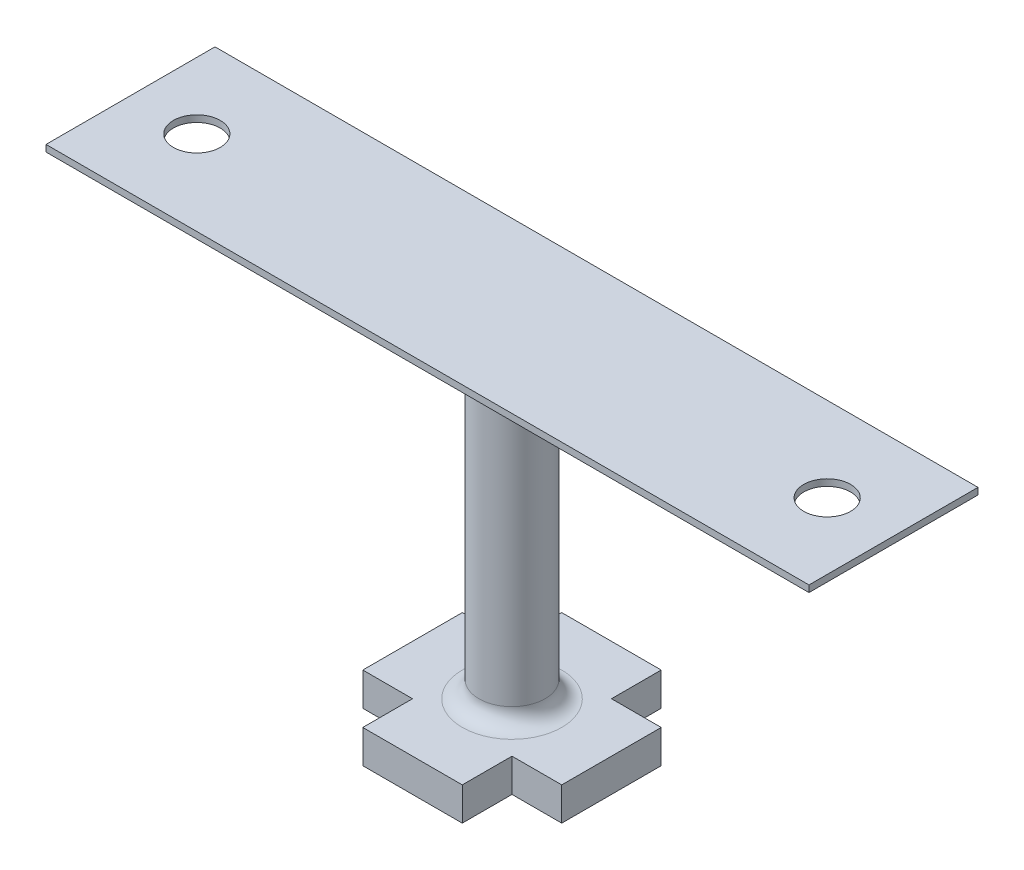
ISO-10303-21;
HEADER;
FILE_DESCRIPTION(('STEP AP214'),'2;1');
FILE_NAME('part.step','',(''),(''),'','','');
FILE_SCHEMA(('AUTOMOTIVE_DESIGN { 1 0 10303 214 1 1 1 1 }'));
ENDSEC;
DATA;
#1=APPLICATION_CONTEXT('core data for automotive mechanical design processes');
#2=APPLICATION_PROTOCOL_DEFINITION('international standard','automotive_design',2000,#1);
#3=PRODUCT_CONTEXT('',#1,'mechanical');
#4=PRODUCT('Part','Part','',(#3));
#5=PRODUCT_RELATED_PRODUCT_CATEGORY('part','',(#4));
#6=PRODUCT_DEFINITION_FORMATION('','',#4);
#7=PRODUCT_DEFINITION_CONTEXT('part definition',#1,'design');
#8=PRODUCT_DEFINITION('design','',#6,#7);
#9=PRODUCT_DEFINITION_SHAPE('','',#8);
#10=(LENGTH_UNIT() NAMED_UNIT(*) SI_UNIT(.MILLI.,.METRE.));
#11=(NAMED_UNIT(*) PLANE_ANGLE_UNIT() SI_UNIT($,.RADIAN.));
#12=(NAMED_UNIT(*) SI_UNIT($,.STERADIAN.) SOLID_ANGLE_UNIT());
#13=UNCERTAINTY_MEASURE_WITH_UNIT(LENGTH_MEASURE(1.E-05),#10,'distance_accuracy_value','');
#14=(GEOMETRIC_REPRESENTATION_CONTEXT(3) GLOBAL_UNCERTAINTY_ASSIGNED_CONTEXT((#13)) GLOBAL_UNIT_ASSIGNED_CONTEXT((#10,
#11,#12)) REPRESENTATION_CONTEXT('',''));
#15=CARTESIAN_POINT('',(0.,0.,0.));
#16=DIRECTION('',(0.,0.,1.));
#17=DIRECTION('',(1.,0.,0.));
#18=AXIS2_PLACEMENT_3D('',#15,#16,#17);
#19=CARTESIAN_POINT('',(0.,2.,0.));
#20=DIRECTION('',(0.,-1.,0.));
#21=DIRECTION('',(0.,0.,-1.));
#22=AXIS2_PLACEMENT_3D('',#19,#20,#21);
#23=PLANE('',#22);
#24=DIRECTION('',(0.,0.,-1.));
#25=VECTOR('',#24,1.);
#26=CARTESIAN_POINT('',(115.06,2.,25.4874549375349));
#27=LINE('',#26,#25);
#28=CARTESIAN_POINT('',(115.06,2.,25.4874549375349));
#29=VERTEX_POINT('',#28);
#30=CARTESIAN_POINT('',(115.06,2.,-25.4874549375349));
#31=VERTEX_POINT('',#30);
#32=EDGE_CURVE('E200',#29,#31,#27,.T.);
#33=ORIENTED_EDGE('',*,*,#32,.T.);
#34=DIRECTION('',(-1.,0.,0.));
#35=VECTOR('',#34,1.);
#36=CARTESIAN_POINT('',(-115.06,2.,-25.4874549375349));
#37=LINE('',#36,#35);
#38=CARTESIAN_POINT('',(-115.06,2.,-25.4874549375349));
#39=VERTEX_POINT('',#38);
#40=EDGE_CURVE('E82',#31,#39,#37,.T.);
#41=ORIENTED_EDGE('',*,*,#40,.T.);
#42=DIRECTION('',(0.,0.,1.));
#43=VECTOR('',#42,1.);
#44=CARTESIAN_POINT('',(-115.06,2.,25.4874549375349));
#45=LINE('',#44,#43);
#46=CARTESIAN_POINT('',(-115.06,2.,25.4874549375349));
#47=VERTEX_POINT('',#46);
#48=EDGE_CURVE('E203',#39,#47,#45,.T.);
#49=ORIENTED_EDGE('',*,*,#48,.T.);
#50=DIRECTION('',(1.,0.,0.));
#51=VECTOR('',#50,1.);
#52=CARTESIAN_POINT('',(-115.06,2.,25.4874549375349));
#53=LINE('',#52,#51);
#54=EDGE_CURVE('E50',#47,#29,#53,.T.);
#55=ORIENTED_EDGE('',*,*,#54,.T.);
#56=EDGE_LOOP('',(#33,#41,#49,#55));
#57=FACE_BOUND('',#56,.T.);
#58=CARTESIAN_POINT('',(-95.06,2.,0.));
#59=DIRECTION('',(0.,1.,0.));
#60=DIRECTION('',(0.,0.,1.));
#61=AXIS2_PLACEMENT_3D('',#58,#59,#60);
#62=CIRCLE('',#61,7.05817378497791);
#63=CARTESIAN_POINT('',(-95.06,2.,7.0581737849779));
#64=VERTEX_POINT('',#63);
#65=EDGE_CURVE('E194',#64,#64,#62,.T.);
#66=ORIENTED_EDGE('',*,*,#65,.F.);
#67=EDGE_LOOP('',(#66));
#68=FACE_BOUND('',#67,.T.);
#69=CARTESIAN_POINT('',(95.06,2.,0.));
#70=DIRECTION('',(0.,1.,0.));
#71=DIRECTION('',(0.,0.,1.));
#72=AXIS2_PLACEMENT_3D('',#69,#70,#71);
#73=CIRCLE('',#72,7.05817378497791);
#74=CARTESIAN_POINT('',(95.06,2.,7.05817378497784));
#75=VERTEX_POINT('',#74);
#76=EDGE_CURVE('E185',#75,#75,#73,.T.);
#77=ORIENTED_EDGE('',*,*,#76,.F.);
#78=EDGE_LOOP('',(#77));
#79=FACE_BOUND('',#78,.T.);
#80=ADVANCED_FACE('F33',(#57,#68,#79),#23,.F.);
#81=CARTESIAN_POINT('',(0.,0.,0.));
#82=DIRECTION('',(0.,-1.,0.));
#83=DIRECTION('',(0.,0.,-1.));
#84=AXIS2_PLACEMENT_3D('',#81,#82,#83);
#85=PLANE('',#84);
#86=CARTESIAN_POINT('',(0.,0.,0.));
#87=DIRECTION('',(0.,-1.,0.));
#88=DIRECTION('',(0.,0.,-1.));
#89=AXIS2_PLACEMENT_3D('',#86,#87,#88);
#90=CIRCLE('',#89,15.);
#91=CARTESIAN_POINT('',(0.,0.,-15.));
#92=VERTEX_POINT('',#91);
#93=EDGE_CURVE('E42',#92,#92,#90,.F.);
#94=ORIENTED_EDGE('',*,*,#93,.T.);
#95=EDGE_LOOP('',(#94));
#96=FACE_BOUND('',#95,.T.);
#97=CARTESIAN_POINT('',(-95.06,0.,0.));
#98=DIRECTION('',(0.,1.,0.));
#99=DIRECTION('',(0.,0.,1.));
#100=AXIS2_PLACEMENT_3D('',#97,#98,#99);
#101=CIRCLE('',#100,7.05817378497791);
#102=CARTESIAN_POINT('',(-95.06,0.,7.0581737849779));
#103=VERTEX_POINT('',#102);
#104=EDGE_CURVE('E192',#103,#103,#101,.T.);
#105=ORIENTED_EDGE('',*,*,#104,.T.);
#106=EDGE_LOOP('',(#105));
#107=FACE_BOUND('',#106,.T.);
#108=DIRECTION('',(0.,0.,-1.));
#109=VECTOR('',#108,1.);
#110=CARTESIAN_POINT('',(115.06,0.,25.4874549375349));
#111=LINE('',#110,#109);
#112=CARTESIAN_POINT('',(115.06,0.,25.4874549375349));
#113=VERTEX_POINT('',#112);
#114=CARTESIAN_POINT('',(115.06,0.,-25.4874549375349));
#115=VERTEX_POINT('',#114);
#116=EDGE_CURVE('E197',#113,#115,#111,.T.);
#117=ORIENTED_EDGE('',*,*,#116,.F.);
#118=DIRECTION('',(1.,0.,0.));
#119=VECTOR('',#118,1.);
#120=CARTESIAN_POINT('',(-115.06,0.,25.4874549375349));
#121=LINE('',#120,#119);
#122=CARTESIAN_POINT('',(-115.06,0.,25.4874549375349));
#123=VERTEX_POINT('',#122);
#124=EDGE_CURVE('E74',#123,#113,#121,.T.);
#125=ORIENTED_EDGE('',*,*,#124,.F.);
#126=DIRECTION('',(0.,0.,1.));
#127=VECTOR('',#126,1.);
#128=CARTESIAN_POINT('',(-115.06,0.,25.4874549375349));
#129=LINE('',#128,#127);
#130=CARTESIAN_POINT('',(-115.06,0.,-25.4874549375349));
#131=VERTEX_POINT('',#130);
#132=EDGE_CURVE('E68',#131,#123,#129,.T.);
#133=ORIENTED_EDGE('',*,*,#132,.F.);
#134=DIRECTION('',(-1.,0.,0.));
#135=VECTOR('',#134,1.);
#136=CARTESIAN_POINT('',(-115.06,0.,-25.4874549375349));
#137=LINE('',#136,#135);
#138=EDGE_CURVE('E209',#115,#131,#137,.T.);
#139=ORIENTED_EDGE('',*,*,#138,.F.);
#140=EDGE_LOOP('',(#117,#125,#133,#139));
#141=FACE_BOUND('',#140,.T.);
#142=CARTESIAN_POINT('',(95.06,0.,0.));
#143=DIRECTION('',(0.,1.,0.));
#144=DIRECTION('',(0.,0.,1.));
#145=AXIS2_PLACEMENT_3D('',#142,#143,#144);
#146=CIRCLE('',#145,7.05817378497791);
#147=CARTESIAN_POINT('',(95.06,0.,7.05817378497784));
#148=VERTEX_POINT('',#147);
#149=EDGE_CURVE('E182',#148,#148,#146,.T.);
#150=ORIENTED_EDGE('',*,*,#149,.T.);
#151=EDGE_LOOP('',(#150));
#152=FACE_BOUND('',#151,.T.);
#153=ADVANCED_FACE('F228',(#96,#107,#141,#152),#85,.T.);
#154=CARTESIAN_POINT('',(115.06,2.,25.4874549375349));
#155=DIRECTION('',(-1.,0.,0.));
#156=DIRECTION('',(0.,0.,1.));
#157=AXIS2_PLACEMENT_3D('',#154,#155,#156);
#158=PLANE('',#157);
#159=ORIENTED_EDGE('',*,*,#116,.T.);
#160=DIRECTION('',(0.,-1.,0.));
#161=VECTOR('',#160,1.);
#162=CARTESIAN_POINT('',(115.06,2.,-25.4874549375349));
#163=LINE('',#162,#161);
#164=EDGE_CURVE('E218',#31,#115,#163,.T.);
#165=ORIENTED_EDGE('',*,*,#164,.F.);
#166=ORIENTED_EDGE('',*,*,#32,.F.);
#167=DIRECTION('',(0.,-1.,0.));
#168=VECTOR('',#167,1.);
#169=CARTESIAN_POINT('',(115.06,2.,25.4874549375349));
#170=LINE('',#169,#168);
#171=EDGE_CURVE('E206',#29,#113,#170,.T.);
#172=ORIENTED_EDGE('',*,*,#171,.T.);
#173=EDGE_LOOP('',(#159,#165,#166,#172));
#174=FACE_BOUND('',#173,.T.);
#175=ADVANCED_FACE('F256',(#174),#158,.F.);
#176=CARTESIAN_POINT('',(-115.06,2.,-25.4874549375349));
#177=DIRECTION('',(0.,0.,1.));
#178=DIRECTION('',(1.,0.,0.));
#179=AXIS2_PLACEMENT_3D('',#176,#177,#178);
#180=PLANE('',#179);
#181=ORIENTED_EDGE('',*,*,#138,.T.);
#182=DIRECTION('',(0.,-1.,0.));
#183=VECTOR('',#182,1.);
#184=CARTESIAN_POINT('',(-115.06,2.,-25.4874549375349));
#185=LINE('',#184,#183);
#186=EDGE_CURVE('E216',#39,#131,#185,.T.);
#187=ORIENTED_EDGE('',*,*,#186,.F.);
#188=ORIENTED_EDGE('',*,*,#40,.F.);
#189=ORIENTED_EDGE('',*,*,#164,.T.);
#190=EDGE_LOOP('',(#181,#187,#188,#189));
#191=FACE_BOUND('',#190,.T.);
#192=ADVANCED_FACE('F269',(#191),#180,.F.);
#193=CARTESIAN_POINT('',(-115.06,2.,25.4874549375349));
#194=DIRECTION('',(1.,0.,0.));
#195=DIRECTION('',(0.,0.,-1.));
#196=AXIS2_PLACEMENT_3D('',#193,#194,#195);
#197=PLANE('',#196);
#198=ORIENTED_EDGE('',*,*,#132,.T.);
#199=DIRECTION('',(0.,-1.,0.));
#200=VECTOR('',#199,1.);
#201=CARTESIAN_POINT('',(-115.06,2.,25.4874549375349));
#202=LINE('',#201,#200);
#203=EDGE_CURVE('E214',#47,#123,#202,.T.);
#204=ORIENTED_EDGE('',*,*,#203,.F.);
#205=ORIENTED_EDGE('',*,*,#48,.F.);
#206=ORIENTED_EDGE('',*,*,#186,.T.);
#207=EDGE_LOOP('',(#198,#204,#205,#206));
#208=FACE_BOUND('',#207,.T.);
#209=ADVANCED_FACE('F266',(#208),#197,.F.);
#210=CARTESIAN_POINT('',(-115.06,2.,25.4874549375349));
#211=DIRECTION('',(0.,0.,-1.));
#212=DIRECTION('',(-1.,0.,0.));
#213=AXIS2_PLACEMENT_3D('',#210,#211,#212);
#214=PLANE('',#213);
#215=ORIENTED_EDGE('',*,*,#124,.T.);
#216=ORIENTED_EDGE('',*,*,#171,.F.);
#217=ORIENTED_EDGE('',*,*,#54,.F.);
#218=ORIENTED_EDGE('',*,*,#203,.T.);
#219=EDGE_LOOP('',(#215,#216,#217,#218));
#220=FACE_BOUND('',#219,.T.);
#221=ADVANCED_FACE('F263',(#220),#214,.F.);
#222=CARTESIAN_POINT('',(-95.06,2.,0.));
#223=DIRECTION('',(0.,-1.,0.));
#224=DIRECTION('',(0.,0.,-1.));
#225=AXIS2_PLACEMENT_3D('',#222,#223,#224);
#226=CYLINDRICAL_SURFACE('',#225,7.05817378497791);
#227=ORIENTED_EDGE('',*,*,#65,.T.);
#228=EDGE_LOOP('',(#227));
#229=FACE_BOUND('',#228,.T.);
#230=ORIENTED_EDGE('',*,*,#104,.F.);
#231=EDGE_LOOP('',(#230));
#232=FACE_BOUND('',#231,.T.);
#233=ADVANCED_FACE('F260',(#229,#232),#226,.F.);
#234=CARTESIAN_POINT('',(95.06,2.,0.));
#235=DIRECTION('',(0.,-1.,0.));
#236=DIRECTION('',(0.,0.,-1.));
#237=AXIS2_PLACEMENT_3D('',#234,#235,#236);
#238=CYLINDRICAL_SURFACE('',#237,7.05817378497791);
#239=ORIENTED_EDGE('',*,*,#76,.T.);
#240=EDGE_LOOP('',(#239));
#241=FACE_BOUND('',#240,.T.);
#242=ORIENTED_EDGE('',*,*,#149,.F.);
#243=EDGE_LOOP('',(#242));
#244=FACE_BOUND('',#243,.T.);
#245=ADVANCED_FACE('F240',(#241,#244),#238,.F.);
#246=CARTESIAN_POINT('',(0.,-98.,0.));
#247=DIRECTION('',(0.,1.,0.));
#248=DIRECTION('',(0.,0.,1.));
#249=AXIS2_PLACEMENT_3D('',#246,#247,#248);
#250=CYLINDRICAL_SURFACE('',#249,10.);
#251=CARTESIAN_POINT('',(0.,-5.00000000000002,0.));
#252=DIRECTION('',(0.,-1.,0.));
#253=DIRECTION('',(0.,0.,-1.));
#254=AXIS2_PLACEMENT_3D('',#251,#252,#253);
#255=CIRCLE('',#254,10.);
#256=CARTESIAN_POINT('',(0.,-5.,10.));
#257=VERTEX_POINT('',#256);
#258=EDGE_CURVE('E223',#257,#257,#255,.T.);
#259=CARTESIAN_POINT('',(0.,-93.,0.));
#260=DIRECTION('',(0.,1.,0.));
#261=DIRECTION('',(0.,0.,1.));
#262=AXIS2_PLACEMENT_3D('',#259,#260,#261);
#263=CIRCLE('',#262,10.);
#264=CARTESIAN_POINT('',(0.,-93.,10.));
#265=VERTEX_POINT('',#264);
#266=EDGE_CURVE('E220',#265,#265,#263,.T.);
#267=CARTESIAN_POINT('',(0.,-5.,10.));
#268=CARTESIAN_POINT('',(0.,-5.91666666666667,10.));
#269=CARTESIAN_POINT('',(0.,-6.83333333333334,10.));
#270=CARTESIAN_POINT('',(0.,-8.66666666666667,10.));
#271=CARTESIAN_POINT('',(0.,-9.58333333333334,10.));
#272=CARTESIAN_POINT('',(0.,-11.4166666666667,10.));
#273=CARTESIAN_POINT('',(0.,-12.3333333333333,10.));
#274=CARTESIAN_POINT('',(0.,-14.1666666666667,10.));
#275=CARTESIAN_POINT('',(0.,-15.0833333333333,10.));
#276=CARTESIAN_POINT('',(0.,-16.9166666666667,10.));
#277=CARTESIAN_POINT('',(0.,-17.8333333333333,10.));
#278=CARTESIAN_POINT('',(0.,-19.6666666666667,10.));
#279=CARTESIAN_POINT('',(0.,-20.5833333333333,10.));
#280=CARTESIAN_POINT('',(0.,-22.4166666666667,10.));
#281=CARTESIAN_POINT('',(0.,-23.3333333333333,10.));
#282=CARTESIAN_POINT('',(0.,-25.1666666666667,10.));
#283=CARTESIAN_POINT('',(0.,-26.0833333333333,10.));
#284=CARTESIAN_POINT('',(0.,-27.9166666666667,10.));
#285=CARTESIAN_POINT('',(0.,-28.8333333333333,10.));
#286=CARTESIAN_POINT('',(0.,-30.6666666666667,10.));
#287=CARTESIAN_POINT('',(0.,-31.5833333333333,10.));
#288=CARTESIAN_POINT('',(0.,-33.4166666666667,10.));
#289=CARTESIAN_POINT('',(0.,-34.3333333333333,10.));
#290=CARTESIAN_POINT('',(0.,-36.1666666666667,10.));
#291=CARTESIAN_POINT('',(0.,-37.0833333333333,10.));
#292=CARTESIAN_POINT('',(0.,-38.9166666666667,10.));
#293=CARTESIAN_POINT('',(0.,-39.8333333333333,10.));
#294=CARTESIAN_POINT('',(0.,-41.6666666666667,10.));
#295=CARTESIAN_POINT('',(0.,-42.5833333333333,10.));
#296=CARTESIAN_POINT('',(0.,-44.4166666666667,10.));
#297=CARTESIAN_POINT('',(0.,-45.3333333333333,10.));
#298=CARTESIAN_POINT('',(0.,-47.1666666666667,10.));
#299=CARTESIAN_POINT('',(0.,-48.0833333333333,10.));
#300=CARTESIAN_POINT('',(0.,-49.9166666666667,10.));
#301=CARTESIAN_POINT('',(0.,-50.8333333333333,10.));
#302=CARTESIAN_POINT('',(0.,-52.6666666666667,10.));
#303=CARTESIAN_POINT('',(0.,-53.5833333333333,10.));
#304=CARTESIAN_POINT('',(0.,-55.4166666666667,10.));
#305=CARTESIAN_POINT('',(0.,-56.3333333333333,10.));
#306=CARTESIAN_POINT('',(0.,-58.1666666666667,10.));
#307=CARTESIAN_POINT('',(0.,-59.0833333333333,10.));
#308=CARTESIAN_POINT('',(0.,-60.9166666666667,10.));
#309=CARTESIAN_POINT('',(0.,-61.8333333333333,10.));
#310=CARTESIAN_POINT('',(0.,-63.6666666666667,10.));
#311=CARTESIAN_POINT('',(0.,-64.5833333333333,10.));
#312=CARTESIAN_POINT('',(0.,-66.4166666666667,10.));
#313=CARTESIAN_POINT('',(0.,-67.3333333333333,10.));
#314=CARTESIAN_POINT('',(0.,-69.1666666666667,10.));
#315=CARTESIAN_POINT('',(0.,-70.0833333333333,10.));
#316=CARTESIAN_POINT('',(0.,-71.9166666666667,10.));
#317=CARTESIAN_POINT('',(0.,-72.8333333333333,10.));
#318=CARTESIAN_POINT('',(0.,-74.6666666666666,10.));
#319=CARTESIAN_POINT('',(0.,-75.5833333333333,10.));
#320=CARTESIAN_POINT('',(0.,-77.4166666666666,10.));
#321=CARTESIAN_POINT('',(0.,-78.3333333333333,10.));
#322=CARTESIAN_POINT('',(0.,-80.1666666666666,10.));
#323=CARTESIAN_POINT('',(0.,-81.0833333333333,10.));
#324=CARTESIAN_POINT('',(0.,-82.9166666666667,10.));
#325=CARTESIAN_POINT('',(0.,-83.8333333333333,10.));
#326=CARTESIAN_POINT('',(0.,-85.6666666666667,10.));
#327=CARTESIAN_POINT('',(0.,-86.5833333333333,10.));
#328=CARTESIAN_POINT('',(0.,-88.4166666666666,10.));
#329=CARTESIAN_POINT('',(0.,-89.3333333333333,10.));
#330=CARTESIAN_POINT('',(0.,-91.1666666666666,10.));
#331=CARTESIAN_POINT('',(0.,-92.0833333333333,10.));
#332=CARTESIAN_POINT('',(0.,-93.,10.));
#333=B_SPLINE_CURVE_WITH_KNOTS('',3,(#267,#268,#269,#270,#271,#272,#273,#274,#275,#276,#277,
#278,#279,#280,#281,#282,#283,#284,#285,#286,#287,#288,#289,#290,#291,#292,#293,#294,#295,#296,
#297,#298,#299,#300,#301,#302,#303,#304,#305,#306,#307,#308,#309,#310,#311,#312,#313,#314,#315,
#316,#317,#318,#319,#320,#321,#322,#323,#324,#325,#326,#327,#328,#329,#330,#331,#332),
.UNSPECIFIED.,.F.,.F.,(4,2,2,2,2,2,2,2,2,2,2,2,2,2,2,2,2,2,2,2,2,2,2,2,2,2,2,2,2,2,2,2,4),(0.,
2.75,5.50000000000001,8.25000000000001,11.,13.75,16.5,19.25,22.,24.75,27.5,30.25,33.,35.75,38.5,
41.25,44.,46.75,49.5,52.25,55.,57.75,60.5,63.25,66.,68.75,71.5,74.25,77.,79.75,82.5,85.25,88.),.UNSPECIFIED.);
#334=EDGE_CURVE('BSEAM237',#257,#265,#333,.T.);
#335=ORIENTED_EDGE('',*,*,#258,.T.);
#336=ORIENTED_EDGE('',*,*,#266,.T.);
#337=ORIENTED_EDGE('',*,*,#334,.T.);
#338=ORIENTED_EDGE('',*,*,#334,.F.);
#339=EDGE_LOOP('',(#335,#337,#336,#338));
#340=FACE_BOUND('',#339,.T.);
#341=ADVANCED_FACE('F237',(#340),#250,.T.);
#342=CARTESIAN_POINT('',(-30.,-108.,15.));
#343=DIRECTION('',(1.,0.,0.));
#344=DIRECTION('',(0.,0.,-1.));
#345=AXIS2_PLACEMENT_3D('',#342,#343,#344);
#346=PLANE('',#345);
#347=DIRECTION('',(0.,0.,-1.));
#348=VECTOR('',#347,1.);
#349=CARTESIAN_POINT('',(-30.,-98.,15.));
#350=LINE('',#349,#348);
#351=CARTESIAN_POINT('',(-30.,-98.,15.));
#352=VERTEX_POINT('',#351);
#353=CARTESIAN_POINT('',(-30.,-98.,-15.));
#354=VERTEX_POINT('',#353);
#355=EDGE_CURVE('E181',#352,#354,#350,.T.);
#356=ORIENTED_EDGE('',*,*,#355,.T.);
#357=DIRECTION('',(0.,1.,0.));
#358=VECTOR('',#357,1.);
#359=CARTESIAN_POINT('',(-30.,-108.,-15.));
#360=LINE('',#359,#358);
#361=CARTESIAN_POINT('',(-30.,-108.,-15.));
#362=VERTEX_POINT('',#361);
#363=EDGE_CURVE('E161',#362,#354,#360,.T.);
#364=ORIENTED_EDGE('',*,*,#363,.F.);
#365=DIRECTION('',(0.,0.,-1.));
#366=VECTOR('',#365,1.);
#367=CARTESIAN_POINT('',(-30.,-108.,15.));
#368=LINE('',#367,#366);
#369=CARTESIAN_POINT('',(-30.,-108.,15.));
#370=VERTEX_POINT('',#369);
#371=EDGE_CURVE('E168',#370,#362,#368,.T.);
#372=ORIENTED_EDGE('',*,*,#371,.F.);
#373=DIRECTION('',(0.,1.,0.));
#374=VECTOR('',#373,1.);
#375=CARTESIAN_POINT('',(-30.,-108.,15.));
#376=LINE('',#375,#374);
#377=EDGE_CURVE('E508',#370,#352,#376,.T.);
#378=ORIENTED_EDGE('',*,*,#377,.T.);
#379=EDGE_LOOP('',(#356,#364,#372,#378));
#380=FACE_BOUND('',#379,.T.);
#381=ADVANCED_FACE('F179',(#380),#346,.F.);
#382=CARTESIAN_POINT('',(-15.,-108.,-15.));
#383=DIRECTION('',(0.,0.,1.));
#384=DIRECTION('',(1.,0.,0.));
#385=AXIS2_PLACEMENT_3D('',#382,#383,#384);
#386=PLANE('',#385);
#387=DIRECTION('',(1.,0.,0.));
#388=VECTOR('',#387,1.);
#389=CARTESIAN_POINT('',(-15.,-98.,-15.));
#390=LINE('',#389,#388);
#391=CARTESIAN_POINT('',(-15.,-98.,-15.));
#392=VERTEX_POINT('',#391);
#393=EDGE_CURVE('E483',#354,#392,#390,.T.);
#394=ORIENTED_EDGE('',*,*,#393,.T.);
#395=DIRECTION('',(0.,1.,0.));
#396=VECTOR('',#395,1.);
#397=CARTESIAN_POINT('',(-15.,-108.,-15.));
#398=LINE('',#397,#396);
#399=CARTESIAN_POINT('',(-15.,-108.,-15.));
#400=VERTEX_POINT('',#399);
#401=EDGE_CURVE('E164',#400,#392,#398,.T.);
#402=ORIENTED_EDGE('',*,*,#401,.F.);
#403=DIRECTION('',(1.,0.,0.));
#404=VECTOR('',#403,1.);
#405=CARTESIAN_POINT('',(-15.,-108.,-15.));
#406=LINE('',#405,#404);
#407=EDGE_CURVE('E157',#362,#400,#406,.T.);
#408=ORIENTED_EDGE('',*,*,#407,.F.);
#409=ORIENTED_EDGE('',*,*,#363,.T.);
#410=EDGE_LOOP('',(#394,#402,#408,#409));
#411=FACE_BOUND('',#410,.T.);
#412=ADVANCED_FACE('F159',(#411),#386,.F.);
#413=CARTESIAN_POINT('',(-15.,-108.,-15.));
#414=DIRECTION('',(1.,0.,0.));
#415=DIRECTION('',(0.,0.,-1.));
#416=AXIS2_PLACEMENT_3D('',#413,#414,#415);
#417=PLANE('',#416);
#418=DIRECTION('',(0.,0.,-1.));
#419=VECTOR('',#418,1.);
#420=CARTESIAN_POINT('',(-15.,-98.,-15.));
#421=LINE('',#420,#419);
#422=CARTESIAN_POINT('',(-15.,-98.,-30.));
#423=VERTEX_POINT('',#422);
#424=EDGE_CURVE('E485',#392,#423,#421,.T.);
#425=ORIENTED_EDGE('',*,*,#424,.T.);
#426=DIRECTION('',(0.,1.,0.));
#427=VECTOR('',#426,1.);
#428=CARTESIAN_POINT('',(-15.,-108.,-30.));
#429=LINE('',#428,#427);
#430=CARTESIAN_POINT('',(-15.,-108.,-30.));
#431=VERTEX_POINT('',#430);
#432=EDGE_CURVE('E187',#431,#423,#429,.T.);
#433=ORIENTED_EDGE('',*,*,#432,.F.);
#434=DIRECTION('',(0.,0.,-1.));
#435=VECTOR('',#434,1.);
#436=CARTESIAN_POINT('',(-15.,-108.,-15.));
#437=LINE('',#436,#435);
#438=EDGE_CURVE('E167',#400,#431,#437,.T.);
#439=ORIENTED_EDGE('',*,*,#438,.F.);
#440=ORIENTED_EDGE('',*,*,#401,.T.);
#441=EDGE_LOOP('',(#425,#433,#439,#440));
#442=FACE_BOUND('',#441,.T.);
#443=ADVANCED_FACE('F295',(#442),#417,.F.);
#444=CARTESIAN_POINT('',(15.,-108.,-30.));
#445=DIRECTION('',(0.,0.,1.));
#446=DIRECTION('',(1.,0.,0.));
#447=AXIS2_PLACEMENT_3D('',#444,#445,#446);
#448=PLANE('',#447);
#449=DIRECTION('',(1.,0.,0.));
#450=VECTOR('',#449,1.);
#451=CARTESIAN_POINT('',(15.,-98.,-30.));
#452=LINE('',#451,#450);
#453=CARTESIAN_POINT('',(15.,-98.,-30.));
#454=VERTEX_POINT('',#453);
#455=EDGE_CURVE('E491',#423,#454,#452,.T.);
#456=ORIENTED_EDGE('',*,*,#455,.T.);
#457=DIRECTION('',(0.,1.,0.));
#458=VECTOR('',#457,1.);
#459=CARTESIAN_POINT('',(15.,-108.,-30.));
#460=LINE('',#459,#458);
#461=CARTESIAN_POINT('',(15.,-108.,-30.));
#462=VERTEX_POINT('',#461);
#463=EDGE_CURVE('E531',#462,#454,#460,.T.);
#464=ORIENTED_EDGE('',*,*,#463,.F.);
#465=DIRECTION('',(1.,0.,0.));
#466=VECTOR('',#465,1.);
#467=CARTESIAN_POINT('',(15.,-108.,-30.));
#468=LINE('',#467,#466);
#469=EDGE_CURVE('E538',#431,#462,#468,.T.);
#470=ORIENTED_EDGE('',*,*,#469,.F.);
#471=ORIENTED_EDGE('',*,*,#432,.T.);
#472=EDGE_LOOP('',(#456,#464,#470,#471));
#473=FACE_BOUND('',#472,.T.);
#474=ADVANCED_FACE('F298',(#473),#448,.F.);
#475=CARTESIAN_POINT('',(15.,-108.,-15.));
#476=DIRECTION('',(-1.,0.,0.));
#477=DIRECTION('',(0.,0.,1.));
#478=AXIS2_PLACEMENT_3D('',#475,#476,#477);
#479=PLANE('',#478);
#480=DIRECTION('',(0.,0.,1.));
#481=VECTOR('',#480,1.);
#482=CARTESIAN_POINT('',(15.,-98.,-15.));
#483=LINE('',#482,#481);
#484=CARTESIAN_POINT('',(15.,-98.,-15.));
#485=VERTEX_POINT('',#484);
#486=EDGE_CURVE('E493',#454,#485,#483,.T.);
#487=ORIENTED_EDGE('',*,*,#486,.T.);
#488=DIRECTION('',(0.,1.,0.));
#489=VECTOR('',#488,1.);
#490=CARTESIAN_POINT('',(15.,-108.,-15.));
#491=LINE('',#490,#489);
#492=CARTESIAN_POINT('',(15.,-108.,-15.));
#493=VERTEX_POINT('',#492);
#494=EDGE_CURVE('E528',#493,#485,#491,.T.);
#495=ORIENTED_EDGE('',*,*,#494,.F.);
#496=DIRECTION('',(0.,0.,1.));
#497=VECTOR('',#496,1.);
#498=CARTESIAN_POINT('',(15.,-108.,-15.));
#499=LINE('',#498,#497);
#500=EDGE_CURVE('E549',#462,#493,#499,.T.);
#501=ORIENTED_EDGE('',*,*,#500,.F.);
#502=ORIENTED_EDGE('',*,*,#463,.T.);
#503=EDGE_LOOP('',(#487,#495,#501,#502));
#504=FACE_BOUND('',#503,.T.);
#505=ADVANCED_FACE('F302',(#504),#479,.F.);
#506=CARTESIAN_POINT('',(30.,-108.,-15.));
#507=DIRECTION('',(0.,0.,1.));
#508=DIRECTION('',(1.,0.,0.));
#509=AXIS2_PLACEMENT_3D('',#506,#507,#508);
#510=PLANE('',#509);
#511=DIRECTION('',(1.,0.,0.));
#512=VECTOR('',#511,1.);
#513=CARTESIAN_POINT('',(30.,-98.,-15.));
#514=LINE('',#513,#512);
#515=CARTESIAN_POINT('',(30.,-98.,-15.));
#516=VERTEX_POINT('',#515);
#517=EDGE_CURVE('E495',#485,#516,#514,.T.);
#518=ORIENTED_EDGE('',*,*,#517,.T.);
#519=DIRECTION('',(0.,1.,0.));
#520=VECTOR('',#519,1.);
#521=CARTESIAN_POINT('',(30.,-108.,-15.));
#522=LINE('',#521,#520);
#523=CARTESIAN_POINT('',(30.,-108.,-15.));
#524=VERTEX_POINT('',#523);
#525=EDGE_CURVE('E525',#524,#516,#522,.T.);
#526=ORIENTED_EDGE('',*,*,#525,.F.);
#527=DIRECTION('',(1.,0.,0.));
#528=VECTOR('',#527,1.);
#529=CARTESIAN_POINT('',(30.,-108.,-15.));
#530=LINE('',#529,#528);
#531=EDGE_CURVE('E546',#493,#524,#530,.T.);
#532=ORIENTED_EDGE('',*,*,#531,.F.);
#533=ORIENTED_EDGE('',*,*,#494,.T.);
#534=EDGE_LOOP('',(#518,#526,#532,#533));
#535=FACE_BOUND('',#534,.T.);
#536=ADVANCED_FACE('F306',(#535),#510,.F.);
#537=CARTESIAN_POINT('',(30.,-108.,15.));
#538=DIRECTION('',(-1.,0.,0.));
#539=DIRECTION('',(0.,0.,1.));
#540=AXIS2_PLACEMENT_3D('',#537,#538,#539);
#541=PLANE('',#540);
#542=DIRECTION('',(0.,0.,1.));
#543=VECTOR('',#542,1.);
#544=CARTESIAN_POINT('',(30.,-98.,15.));
#545=LINE('',#544,#543);
#546=CARTESIAN_POINT('',(30.,-98.,15.));
#547=VERTEX_POINT('',#546);
#548=EDGE_CURVE('E497',#516,#547,#545,.T.);
#549=ORIENTED_EDGE('',*,*,#548,.T.);
#550=DIRECTION('',(0.,1.,0.));
#551=VECTOR('',#550,1.);
#552=CARTESIAN_POINT('',(30.,-108.,15.));
#553=LINE('',#552,#551);
#554=CARTESIAN_POINT('',(30.,-108.,15.));
#555=VERTEX_POINT('',#554);
#556=EDGE_CURVE('E522',#555,#547,#553,.T.);
#557=ORIENTED_EDGE('',*,*,#556,.F.);
#558=DIRECTION('',(0.,0.,1.));
#559=VECTOR('',#558,1.);
#560=CARTESIAN_POINT('',(30.,-108.,15.));
#561=LINE('',#560,#559);
#562=EDGE_CURVE('E548',#524,#555,#561,.T.);
#563=ORIENTED_EDGE('',*,*,#562,.F.);
#564=ORIENTED_EDGE('',*,*,#525,.T.);
#565=EDGE_LOOP('',(#549,#557,#563,#564));
#566=FACE_BOUND('',#565,.T.);
#567=ADVANCED_FACE('F310',(#566),#541,.F.);
#568=CARTESIAN_POINT('',(30.,-108.,15.));
#569=DIRECTION('',(0.,0.,-1.));
#570=DIRECTION('',(-1.,0.,0.));
#571=AXIS2_PLACEMENT_3D('',#568,#569,#570);
#572=PLANE('',#571);
#573=DIRECTION('',(-1.,0.,0.));
#574=VECTOR('',#573,1.);
#575=CARTESIAN_POINT('',(30.,-98.,15.));
#576=LINE('',#575,#574);
#577=CARTESIAN_POINT('',(15.,-98.,15.));
#578=VERTEX_POINT('',#577);
#579=EDGE_CURVE('E499',#547,#578,#576,.T.);
#580=ORIENTED_EDGE('',*,*,#579,.T.);
#581=DIRECTION('',(0.,1.,0.));
#582=VECTOR('',#581,1.);
#583=CARTESIAN_POINT('',(15.,-108.,15.));
#584=LINE('',#583,#582);
#585=CARTESIAN_POINT('',(15.,-108.,15.));
#586=VERTEX_POINT('',#585);
#587=EDGE_CURVE('E519',#586,#578,#584,.T.);
#588=ORIENTED_EDGE('',*,*,#587,.F.);
#589=DIRECTION('',(-1.,0.,0.));
#590=VECTOR('',#589,1.);
#591=CARTESIAN_POINT('',(30.,-108.,15.));
#592=LINE('',#591,#590);
#593=EDGE_CURVE('E551',#555,#586,#592,.T.);
#594=ORIENTED_EDGE('',*,*,#593,.F.);
#595=ORIENTED_EDGE('',*,*,#556,.T.);
#596=EDGE_LOOP('',(#580,#588,#594,#595));
#597=FACE_BOUND('',#596,.T.);
#598=ADVANCED_FACE('F314',(#597),#572,.F.);
#599=CARTESIAN_POINT('',(15.,-108.,30.));
#600=DIRECTION('',(-1.,0.,0.));
#601=DIRECTION('',(0.,0.,1.));
#602=AXIS2_PLACEMENT_3D('',#599,#600,#601);
#603=PLANE('',#602);
#604=DIRECTION('',(0.,0.,1.));
#605=VECTOR('',#604,1.);
#606=CARTESIAN_POINT('',(15.,-98.,30.));
#607=LINE('',#606,#605);
#608=CARTESIAN_POINT('',(15.,-98.,30.));
#609=VERTEX_POINT('',#608);
#610=EDGE_CURVE('E501',#578,#609,#607,.T.);
#611=ORIENTED_EDGE('',*,*,#610,.T.);
#612=DIRECTION('',(0.,1.,0.));
#613=VECTOR('',#612,1.);
#614=CARTESIAN_POINT('',(15.,-108.,30.));
#615=LINE('',#614,#613);
#616=CARTESIAN_POINT('',(15.,-108.,30.));
#617=VERTEX_POINT('',#616);
#618=EDGE_CURVE('E516',#617,#609,#615,.T.);
#619=ORIENTED_EDGE('',*,*,#618,.F.);
#620=DIRECTION('',(0.,0.,1.));
#621=VECTOR('',#620,1.);
#622=CARTESIAN_POINT('',(15.,-108.,30.));
#623=LINE('',#622,#621);
#624=EDGE_CURVE('E557',#586,#617,#623,.T.);
#625=ORIENTED_EDGE('',*,*,#624,.F.);
#626=ORIENTED_EDGE('',*,*,#587,.T.);
#627=EDGE_LOOP('',(#611,#619,#625,#626));
#628=FACE_BOUND('',#627,.T.);
#629=ADVANCED_FACE('F318',(#628),#603,.F.);
#630=CARTESIAN_POINT('',(15.,-108.,30.));
#631=DIRECTION('',(0.,0.,-1.));
#632=DIRECTION('',(-1.,0.,0.));
#633=AXIS2_PLACEMENT_3D('',#630,#631,#632);
#634=PLANE('',#633);
#635=DIRECTION('',(-1.,0.,0.));
#636=VECTOR('',#635,1.);
#637=CARTESIAN_POINT('',(15.,-98.,30.));
#638=LINE('',#637,#636);
#639=CARTESIAN_POINT('',(-15.,-98.,30.));
#640=VERTEX_POINT('',#639);
#641=EDGE_CURVE('E503',#609,#640,#638,.T.);
#642=ORIENTED_EDGE('',*,*,#641,.T.);
#643=DIRECTION('',(0.,1.,0.));
#644=VECTOR('',#643,1.);
#645=CARTESIAN_POINT('',(-15.,-108.,30.));
#646=LINE('',#645,#644);
#647=CARTESIAN_POINT('',(-15.,-108.,30.));
#648=VERTEX_POINT('',#647);
#649=EDGE_CURVE('E513',#648,#640,#646,.T.);
#650=ORIENTED_EDGE('',*,*,#649,.F.);
#651=DIRECTION('',(-1.,0.,0.));
#652=VECTOR('',#651,1.);
#653=CARTESIAN_POINT('',(15.,-108.,30.));
#654=LINE('',#653,#652);
#655=EDGE_CURVE('E559',#617,#648,#654,.T.);
#656=ORIENTED_EDGE('',*,*,#655,.F.);
#657=ORIENTED_EDGE('',*,*,#618,.T.);
#658=EDGE_LOOP('',(#642,#650,#656,#657));
#659=FACE_BOUND('',#658,.T.);
#660=ADVANCED_FACE('F322',(#659),#634,.F.);
#661=CARTESIAN_POINT('',(-15.,-108.,30.));
#662=DIRECTION('',(1.,0.,0.));
#663=DIRECTION('',(0.,0.,-1.));
#664=AXIS2_PLACEMENT_3D('',#661,#662,#663);
#665=PLANE('',#664);
#666=DIRECTION('',(0.,0.,-1.));
#667=VECTOR('',#666,1.);
#668=CARTESIAN_POINT('',(-15.,-98.,30.));
#669=LINE('',#668,#667);
#670=CARTESIAN_POINT('',(-15.,-98.,15.));
#671=VERTEX_POINT('',#670);
#672=EDGE_CURVE('E505',#640,#671,#669,.T.);
#673=ORIENTED_EDGE('',*,*,#672,.T.);
#674=DIRECTION('',(0.,1.,0.));
#675=VECTOR('',#674,1.);
#676=CARTESIAN_POINT('',(-15.,-108.,15.));
#677=LINE('',#676,#675);
#678=CARTESIAN_POINT('',(-15.,-108.,15.));
#679=VERTEX_POINT('',#678);
#680=EDGE_CURVE('E510',#679,#671,#677,.T.);
#681=ORIENTED_EDGE('',*,*,#680,.F.);
#682=DIRECTION('',(0.,0.,-1.));
#683=VECTOR('',#682,1.);
#684=CARTESIAN_POINT('',(-15.,-108.,30.));
#685=LINE('',#684,#683);
#686=EDGE_CURVE('E560',#648,#679,#685,.T.);
#687=ORIENTED_EDGE('',*,*,#686,.F.);
#688=ORIENTED_EDGE('',*,*,#649,.T.);
#689=EDGE_LOOP('',(#673,#681,#687,#688));
#690=FACE_BOUND('',#689,.T.);
#691=ADVANCED_FACE('F326',(#690),#665,.F.);
#692=CARTESIAN_POINT('',(-15.,-108.,15.));
#693=DIRECTION('',(0.,0.,-1.));
#694=DIRECTION('',(-1.,0.,0.));
#695=AXIS2_PLACEMENT_3D('',#692,#693,#694);
#696=PLANE('',#695);
#697=DIRECTION('',(-1.,0.,0.));
#698=VECTOR('',#697,1.);
#699=CARTESIAN_POINT('',(-15.,-98.,15.));
#700=LINE('',#699,#698);
#701=EDGE_CURVE('E177',#671,#352,#700,.T.);
#702=ORIENTED_EDGE('',*,*,#701,.T.);
#703=ORIENTED_EDGE('',*,*,#377,.F.);
#704=DIRECTION('',(-1.,0.,0.));
#705=VECTOR('',#704,1.);
#706=CARTESIAN_POINT('',(-15.,-108.,15.));
#707=LINE('',#706,#705);
#708=EDGE_CURVE('E173',#679,#370,#707,.T.);
#709=ORIENTED_EDGE('',*,*,#708,.F.);
#710=ORIENTED_EDGE('',*,*,#680,.T.);
#711=EDGE_LOOP('',(#702,#703,#709,#710));
#712=FACE_BOUND('',#711,.T.);
#713=ADVANCED_FACE('F330',(#712),#696,.F.);
#714=CARTESIAN_POINT('',(0.,-108.,0.));
#715=DIRECTION('',(0.,1.,0.));
#716=DIRECTION('',(0.,0.,1.));
#717=AXIS2_PLACEMENT_3D('',#714,#715,#716);
#718=PLANE('',#717);
#719=ORIENTED_EDGE('',*,*,#371,.T.);
#720=ORIENTED_EDGE('',*,*,#407,.T.);
#721=ORIENTED_EDGE('',*,*,#438,.T.);
#722=ORIENTED_EDGE('',*,*,#469,.T.);
#723=ORIENTED_EDGE('',*,*,#500,.T.);
#724=ORIENTED_EDGE('',*,*,#531,.T.);
#725=ORIENTED_EDGE('',*,*,#562,.T.);
#726=ORIENTED_EDGE('',*,*,#593,.T.);
#727=ORIENTED_EDGE('',*,*,#624,.T.);
#728=ORIENTED_EDGE('',*,*,#655,.T.);
#729=ORIENTED_EDGE('',*,*,#686,.T.);
#730=ORIENTED_EDGE('',*,*,#708,.T.);
#731=EDGE_LOOP('',(#719,#720,#721,#722,#723,#724,#725,#726,#727,#728,#729,#730));
#732=FACE_BOUND('',#731,.T.);
#733=ADVANCED_FACE('F171',(#732),#718,.F.);
#734=CARTESIAN_POINT('',(0.,-98.,0.));
#735=DIRECTION('',(0.,1.,0.));
#736=DIRECTION('',(0.,0.,1.));
#737=AXIS2_PLACEMENT_3D('',#734,#735,#736);
#738=PLANE('',#737);
#739=CARTESIAN_POINT('',(0.,-98.,0.));
#740=DIRECTION('',(0.,1.,0.));
#741=DIRECTION('',(0.,0.,1.));
#742=AXIS2_PLACEMENT_3D('',#739,#740,#741);
#743=CIRCLE('',#742,15.);
#744=CARTESIAN_POINT('',(0.,-98.,15.));
#745=VERTEX_POINT('',#744);
#746=EDGE_CURVE('E11',#745,#745,#743,.F.);
#747=ORIENTED_EDGE('',*,*,#746,.T.);
#748=EDGE_LOOP('',(#747));
#749=FACE_BOUND('',#748,.T.);
#750=ORIENTED_EDGE('',*,*,#355,.F.);
#751=ORIENTED_EDGE('',*,*,#701,.F.);
#752=ORIENTED_EDGE('',*,*,#672,.F.);
#753=ORIENTED_EDGE('',*,*,#641,.F.);
#754=ORIENTED_EDGE('',*,*,#610,.F.);
#755=ORIENTED_EDGE('',*,*,#579,.F.);
#756=ORIENTED_EDGE('',*,*,#548,.F.);
#757=ORIENTED_EDGE('',*,*,#517,.F.);
#758=ORIENTED_EDGE('',*,*,#486,.F.);
#759=ORIENTED_EDGE('',*,*,#455,.F.);
#760=ORIENTED_EDGE('',*,*,#424,.F.);
#761=ORIENTED_EDGE('',*,*,#393,.F.);
#762=EDGE_LOOP('',(#750,#751,#752,#753,#754,#755,#756,#757,#758,#759,#760,#761));
#763=FACE_BOUND('',#762,.T.);
#764=ADVANCED_FACE('F234',(#749,#763),#738,.T.);
#765=CARTESIAN_POINT('',(0.,-5.,0.));
#766=DIRECTION('',(0.,-1.,0.));
#767=DIRECTION('',(0.,0.,-1.));
#768=AXIS2_PLACEMENT_3D('',#765,#766,#767);
#769=TOROIDAL_SURFACE('',#768,15.,5.);
#770=ORIENTED_EDGE('',*,*,#93,.F.);
#771=EDGE_LOOP('',(#770));
#772=FACE_BOUND('',#771,.T.);
#773=ORIENTED_EDGE('',*,*,#258,.F.);
#774=EDGE_LOOP('',(#773));
#775=FACE_BOUND('',#774,.T.);
#776=ADVANCED_FACE('F231',(#772,#775),#769,.F.);
#777=CARTESIAN_POINT('',(0.,-93.,0.));
#778=DIRECTION('',(0.,1.,0.));
#779=DIRECTION('',(0.,0.,1.));
#780=AXIS2_PLACEMENT_3D('',#777,#778,#779);
#781=TOROIDAL_SURFACE('',#780,15.,5.);
#782=ORIENTED_EDGE('',*,*,#746,.F.);
#783=EDGE_LOOP('',(#782));
#784=FACE_BOUND('',#783,.T.);
#785=ORIENTED_EDGE('',*,*,#266,.F.);
#786=EDGE_LOOP('',(#785));
#787=FACE_BOUND('',#786,.T.);
#788=ADVANCED_FACE('F35',(#784,#787),#781,.F.);
#789=CLOSED_SHELL('',(#80,#153,#175,#192,#209,#221,#233,#245,#341,#381,#412,#443,#474,#505,#536,
#567,#598,#629,#660,#691,#713,#733,#764,#776,#788));
#790=MANIFOLD_SOLID_BREP('B2',#789);
#791=ADVANCED_BREP_SHAPE_REPRESENTATION('',(#18,#790),#14);
#792=SHAPE_DEFINITION_REPRESENTATION(#9,#791);
ENDSEC;
END-ISO-10303-21;
